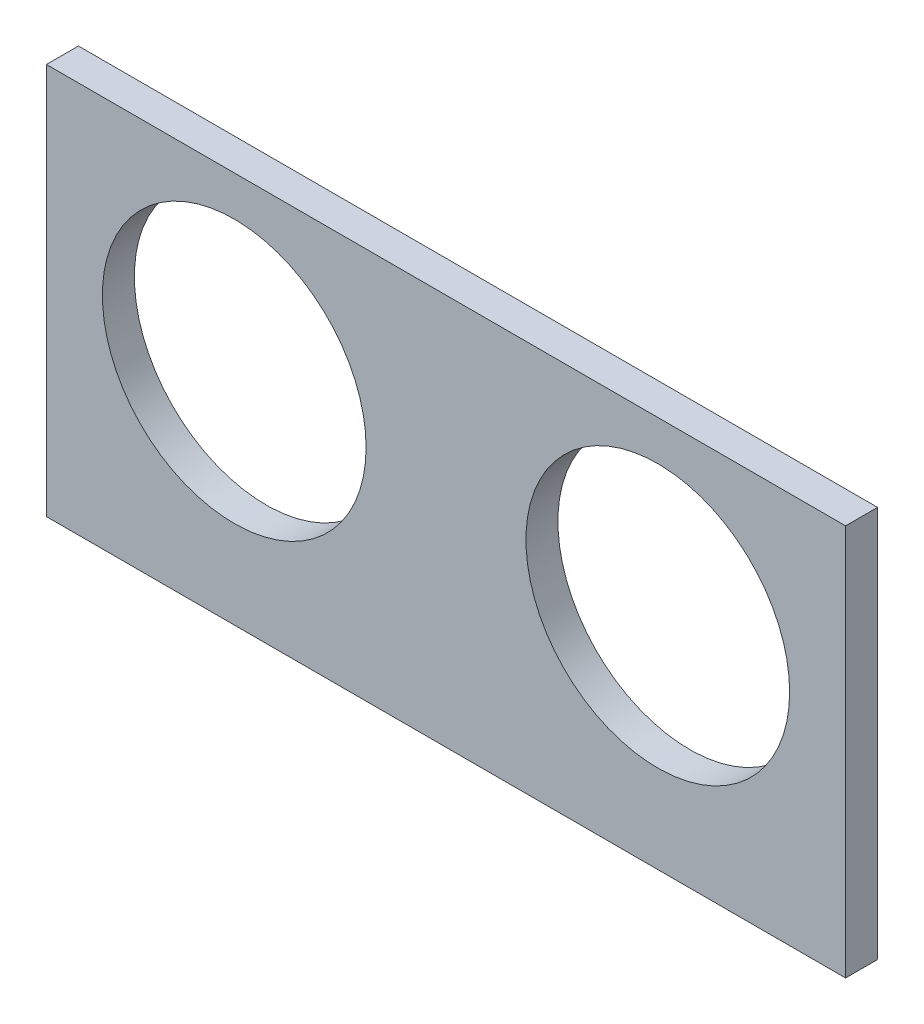
ISO-10303-21;
HEADER;
FILE_DESCRIPTION(('STEP AP214'),'2;1');
FILE_NAME('part.step','',(''),(''),'','','');
FILE_SCHEMA(('AUTOMOTIVE_DESIGN { 1 0 10303 214 1 1 1 1 }'));
ENDSEC;
DATA;
#1=APPLICATION_CONTEXT('core data for automotive mechanical design processes');
#2=APPLICATION_PROTOCOL_DEFINITION('international standard','automotive_design',2000,#1);
#3=PRODUCT_CONTEXT('',#1,'mechanical');
#4=PRODUCT('Part','Part','',(#3));
#5=PRODUCT_RELATED_PRODUCT_CATEGORY('part','',(#4));
#6=PRODUCT_DEFINITION_FORMATION('','',#4);
#7=PRODUCT_DEFINITION_CONTEXT('part definition',#1,'design');
#8=PRODUCT_DEFINITION('design','',#6,#7);
#9=PRODUCT_DEFINITION_SHAPE('','',#8);
#10=(LENGTH_UNIT() NAMED_UNIT(*) SI_UNIT(.MILLI.,.METRE.));
#11=(NAMED_UNIT(*) PLANE_ANGLE_UNIT() SI_UNIT($,.RADIAN.));
#12=(NAMED_UNIT(*) SI_UNIT($,.STERADIAN.) SOLID_ANGLE_UNIT());
#13=UNCERTAINTY_MEASURE_WITH_UNIT(LENGTH_MEASURE(1.E-05),#10,'distance_accuracy_value','');
#14=(GEOMETRIC_REPRESENTATION_CONTEXT(3) GLOBAL_UNCERTAINTY_ASSIGNED_CONTEXT((#13)) GLOBAL_UNIT_ASSIGNED_CONTEXT((#10,
#11,#12)) REPRESENTATION_CONTEXT('',''));
#15=CARTESIAN_POINT('',(0.,0.,0.));
#16=DIRECTION('',(0.,0.,1.));
#17=DIRECTION('',(1.,0.,0.));
#18=AXIS2_PLACEMENT_3D('',#15,#16,#17);
#19=CARTESIAN_POINT('',(0.,22.5,2.));
#20=DIRECTION('',(1.,0.,0.));
#21=DIRECTION('',(0.,1.,0.));
#22=AXIS2_PLACEMENT_3D('',#19,#20,#21);
#23=PLANE('',#22);
#24=DIRECTION('',(0.,-1.,0.));
#25=VECTOR('',#24,1.);
#26=CARTESIAN_POINT('',(0.,22.5,0.));
#27=LINE('',#26,#25);
#28=CARTESIAN_POINT('',(0.,24.5,0.));
#29=VERTEX_POINT('',#28);
#30=CARTESIAN_POINT('',(0.,0.,0.));
#31=VERTEX_POINT('',#30);
#32=EDGE_CURVE('E72',#29,#31,#27,.T.);
#33=ORIENTED_EDGE('',*,*,#32,.T.);
#34=DIRECTION('',(0.,0.,-1.));
#35=VECTOR('',#34,1.);
#36=CARTESIAN_POINT('',(0.,0.,2.));
#37=LINE('',#36,#35);
#38=CARTESIAN_POINT('',(0.,0.,2.));
#39=VERTEX_POINT('',#38);
#40=EDGE_CURVE('E11',#39,#31,#37,.T.);
#41=ORIENTED_EDGE('',*,*,#40,.F.);
#42=DIRECTION('',(0.,-1.,0.));
#43=VECTOR('',#42,1.);
#44=CARTESIAN_POINT('',(0.,22.5,2.));
#45=LINE('',#44,#43);
#46=CARTESIAN_POINT('',(0.,24.5,2.));
#47=VERTEX_POINT('',#46);
#48=EDGE_CURVE('E86',#47,#39,#45,.T.);
#49=ORIENTED_EDGE('',*,*,#48,.F.);
#50=DIRECTION('',(0.,0.,1.));
#51=VECTOR('',#50,1.);
#52=CARTESIAN_POINT('',(0.,24.5,0.));
#53=LINE('',#52,#51);
#54=EDGE_CURVE('E89',#29,#47,#53,.T.);
#55=ORIENTED_EDGE('',*,*,#54,.F.);
#56=EDGE_LOOP('',(#33,#41,#49,#55));
#57=FACE_BOUND('',#56,.T.);
#58=ADVANCED_FACE('F44',(#57),#23,.F.);
#59=CARTESIAN_POINT('',(0.,0.,2.));
#60=DIRECTION('',(0.,1.,0.));
#61=DIRECTION('',(0.,0.,1.));
#62=AXIS2_PLACEMENT_3D('',#59,#60,#61);
#63=PLANE('',#62);
#64=DIRECTION('',(1.,0.,0.));
#65=VECTOR('',#64,1.);
#66=CARTESIAN_POINT('',(0.,0.,0.));
#67=LINE('',#66,#65);
#68=CARTESIAN_POINT('',(50.,0.,0.));
#69=VERTEX_POINT('',#68);
#70=EDGE_CURVE('E135',#31,#69,#67,.T.);
#71=ORIENTED_EDGE('',*,*,#70,.T.);
#72=DIRECTION('',(0.,0.,-1.));
#73=VECTOR('',#72,1.);
#74=CARTESIAN_POINT('',(50.,0.,2.));
#75=LINE('',#74,#73);
#76=CARTESIAN_POINT('',(50.,0.,2.));
#77=VERTEX_POINT('',#76);
#78=EDGE_CURVE('E53',#77,#69,#75,.T.);
#79=ORIENTED_EDGE('',*,*,#78,.F.);
#80=DIRECTION('',(1.,0.,0.));
#81=VECTOR('',#80,1.);
#82=CARTESIAN_POINT('',(0.,0.,2.));
#83=LINE('',#82,#81);
#84=EDGE_CURVE('E61',#39,#77,#83,.T.);
#85=ORIENTED_EDGE('',*,*,#84,.F.);
#86=ORIENTED_EDGE('',*,*,#40,.T.);
#87=EDGE_LOOP('',(#71,#79,#85,#86));
#88=FACE_BOUND('',#87,.T.);
#89=ADVANCED_FACE('F146',(#88),#63,.F.);
#90=CARTESIAN_POINT('',(50.,0.,2.));
#91=DIRECTION('',(-1.,0.,0.));
#92=DIRECTION('',(0.,0.,1.));
#93=AXIS2_PLACEMENT_3D('',#90,#91,#92);
#94=PLANE('',#93);
#95=DIRECTION('',(0.,1.,0.));
#96=VECTOR('',#95,1.);
#97=CARTESIAN_POINT('',(50.,0.,0.));
#98=LINE('',#97,#96);
#99=CARTESIAN_POINT('',(50.,24.5,0.));
#100=VERTEX_POINT('',#99);
#101=EDGE_CURVE('E91',#69,#100,#98,.T.);
#102=ORIENTED_EDGE('',*,*,#101,.T.);
#103=DIRECTION('',(0.,0.,-1.));
#104=VECTOR('',#103,1.);
#105=CARTESIAN_POINT('',(50.,24.5,0.));
#106=LINE('',#105,#104);
#107=CARTESIAN_POINT('',(50.,24.5,2.));
#108=VERTEX_POINT('',#107);
#109=EDGE_CURVE('E102',#108,#100,#106,.T.);
#110=ORIENTED_EDGE('',*,*,#109,.F.);
#111=DIRECTION('',(0.,1.,0.));
#112=VECTOR('',#111,1.);
#113=CARTESIAN_POINT('',(50.,0.,2.));
#114=LINE('',#113,#112);
#115=EDGE_CURVE('E97',#77,#108,#114,.T.);
#116=ORIENTED_EDGE('',*,*,#115,.F.);
#117=ORIENTED_EDGE('',*,*,#78,.T.);
#118=EDGE_LOOP('',(#102,#110,#116,#117));
#119=FACE_BOUND('',#118,.T.);
#120=ADVANCED_FACE('F143',(#119),#94,.F.);
#121=CARTESIAN_POINT('',(0.,0.,2.));
#122=DIRECTION('',(0.,0.,1.));
#123=DIRECTION('',(1.,0.,0.));
#124=AXIS2_PLACEMENT_3D('',#121,#122,#123);
#125=PLANE('',#124);
#126=CARTESIAN_POINT('',(11.75,13.75,2.));
#127=DIRECTION('',(0.,0.,1.));
#128=DIRECTION('',(1.,0.,0.));
#129=AXIS2_PLACEMENT_3D('',#126,#127,#128);
#130=CIRCLE('',#129,8.25);
#131=CARTESIAN_POINT('',(20.,13.75,2.));
#132=VERTEX_POINT('',#131);
#133=EDGE_CURVE('E118',#132,#132,#130,.T.);
#134=ORIENTED_EDGE('',*,*,#133,.F.);
#135=EDGE_LOOP('',(#134));
#136=FACE_BOUND('',#135,.T.);
#137=CARTESIAN_POINT('',(38.25,13.75,2.));
#138=DIRECTION('',(0.,0.,1.));
#139=DIRECTION('',(1.,0.,0.));
#140=AXIS2_PLACEMENT_3D('',#137,#138,#139);
#141=CIRCLE('',#140,8.25000000000001);
#142=CARTESIAN_POINT('',(46.5,13.75,2.));
#143=VERTEX_POINT('',#142);
#144=EDGE_CURVE('E122',#143,#143,#141,.T.);
#145=ORIENTED_EDGE('',*,*,#144,.F.);
#146=EDGE_LOOP('',(#145));
#147=FACE_BOUND('',#146,.T.);
#148=ORIENTED_EDGE('',*,*,#115,.T.);
#149=DIRECTION('',(1.,0.,0.));
#150=VECTOR('',#149,1.);
#151=CARTESIAN_POINT('',(0.,24.5,2.));
#152=LINE('',#151,#150);
#153=EDGE_CURVE('E94',#47,#108,#152,.T.);
#154=ORIENTED_EDGE('',*,*,#153,.F.);
#155=ORIENTED_EDGE('',*,*,#48,.T.);
#156=ORIENTED_EDGE('',*,*,#84,.T.);
#157=EDGE_LOOP('',(#148,#154,#155,#156));
#158=FACE_BOUND('',#157,.T.);
#159=ADVANCED_FACE('F95',(#136,#147,#158),#125,.T.);
#160=CARTESIAN_POINT('',(0.,0.,0.));
#161=DIRECTION('',(0.,0.,1.));
#162=DIRECTION('',(1.,0.,0.));
#163=AXIS2_PLACEMENT_3D('',#160,#161,#162);
#164=PLANE('',#163);
#165=CARTESIAN_POINT('',(11.75,13.75,0.));
#166=DIRECTION('',(0.,0.,1.));
#167=DIRECTION('',(1.,0.,0.));
#168=AXIS2_PLACEMENT_3D('',#165,#166,#167);
#169=CIRCLE('',#168,8.25);
#170=CARTESIAN_POINT('',(20.,13.75,0.));
#171=VERTEX_POINT('',#170);
#172=EDGE_CURVE('E114',#171,#171,#169,.T.);
#173=ORIENTED_EDGE('',*,*,#172,.T.);
#174=EDGE_LOOP('',(#173));
#175=FACE_BOUND('',#174,.T.);
#176=CARTESIAN_POINT('',(38.25,13.75,0.));
#177=DIRECTION('',(0.,0.,1.));
#178=DIRECTION('',(1.,0.,0.));
#179=AXIS2_PLACEMENT_3D('',#176,#177,#178);
#180=CIRCLE('',#179,8.25000000000001);
#181=CARTESIAN_POINT('',(46.5,13.75,0.));
#182=VERTEX_POINT('',#181);
#183=EDGE_CURVE('E113',#182,#182,#180,.T.);
#184=ORIENTED_EDGE('',*,*,#183,.T.);
#185=EDGE_LOOP('',(#184));
#186=FACE_BOUND('',#185,.T.);
#187=ORIENTED_EDGE('',*,*,#32,.F.);
#188=DIRECTION('',(-1.,0.,0.));
#189=VECTOR('',#188,1.);
#190=CARTESIAN_POINT('',(0.,24.5,0.));
#191=LINE('',#190,#189);
#192=EDGE_CURVE('E105',#100,#29,#191,.T.);
#193=ORIENTED_EDGE('',*,*,#192,.F.);
#194=ORIENTED_EDGE('',*,*,#101,.F.);
#195=ORIENTED_EDGE('',*,*,#70,.F.);
#196=EDGE_LOOP('',(#187,#193,#194,#195));
#197=FACE_BOUND('',#196,.T.);
#198=ADVANCED_FACE('F145',(#175,#186,#197),#164,.F.);
#199=CARTESIAN_POINT('',(38.25,13.75,0.));
#200=DIRECTION('',(0.,0.,1.));
#201=DIRECTION('',(1.,0.,0.));
#202=AXIS2_PLACEMENT_3D('',#199,#200,#201);
#203=CYLINDRICAL_SURFACE('',#202,8.25000000000001);
#204=ORIENTED_EDGE('',*,*,#183,.F.);
#205=EDGE_LOOP('',(#204));
#206=FACE_BOUND('',#205,.T.);
#207=ORIENTED_EDGE('',*,*,#144,.T.);
#208=EDGE_LOOP('',(#207));
#209=FACE_BOUND('',#208,.T.);
#210=ADVANCED_FACE('F157',(#206,#209),#203,.F.);
#211=CARTESIAN_POINT('',(11.75,13.75,0.));
#212=DIRECTION('',(0.,0.,1.));
#213=DIRECTION('',(1.,0.,0.));
#214=AXIS2_PLACEMENT_3D('',#211,#212,#213);
#215=CYLINDRICAL_SURFACE('',#214,8.25);
#216=ORIENTED_EDGE('',*,*,#172,.F.);
#217=EDGE_LOOP('',(#216));
#218=FACE_BOUND('',#217,.T.);
#219=ORIENTED_EDGE('',*,*,#133,.T.);
#220=EDGE_LOOP('',(#219));
#221=FACE_BOUND('',#220,.T.);
#222=ADVANCED_FACE('F163',(#218,#221),#215,.F.);
#223=CARTESIAN_POINT('',(0.,24.5,0.));
#224=DIRECTION('',(0.,1.,0.));
#225=DIRECTION('',(-1.,0.,0.));
#226=AXIS2_PLACEMENT_3D('',#223,#224,#225);
#227=PLANE('',#226);
#228=ORIENTED_EDGE('',*,*,#54,.T.);
#229=ORIENTED_EDGE('',*,*,#153,.T.);
#230=ORIENTED_EDGE('',*,*,#109,.T.);
#231=ORIENTED_EDGE('',*,*,#192,.T.);
#232=EDGE_LOOP('',(#228,#229,#230,#231));
#233=FACE_BOUND('',#232,.T.);
#234=ADVANCED_FACE('F104',(#233),#227,.T.);
#235=CLOSED_SHELL('',(#58,#89,#120,#159,#198,#210,#222,#234));
#236=MANIFOLD_SOLID_BREP('B2',#235);
#237=ADVANCED_BREP_SHAPE_REPRESENTATION('',(#18,#236),#14);
#238=SHAPE_DEFINITION_REPRESENTATION(#9,#237);
ENDSEC;
END-ISO-10303-21;
